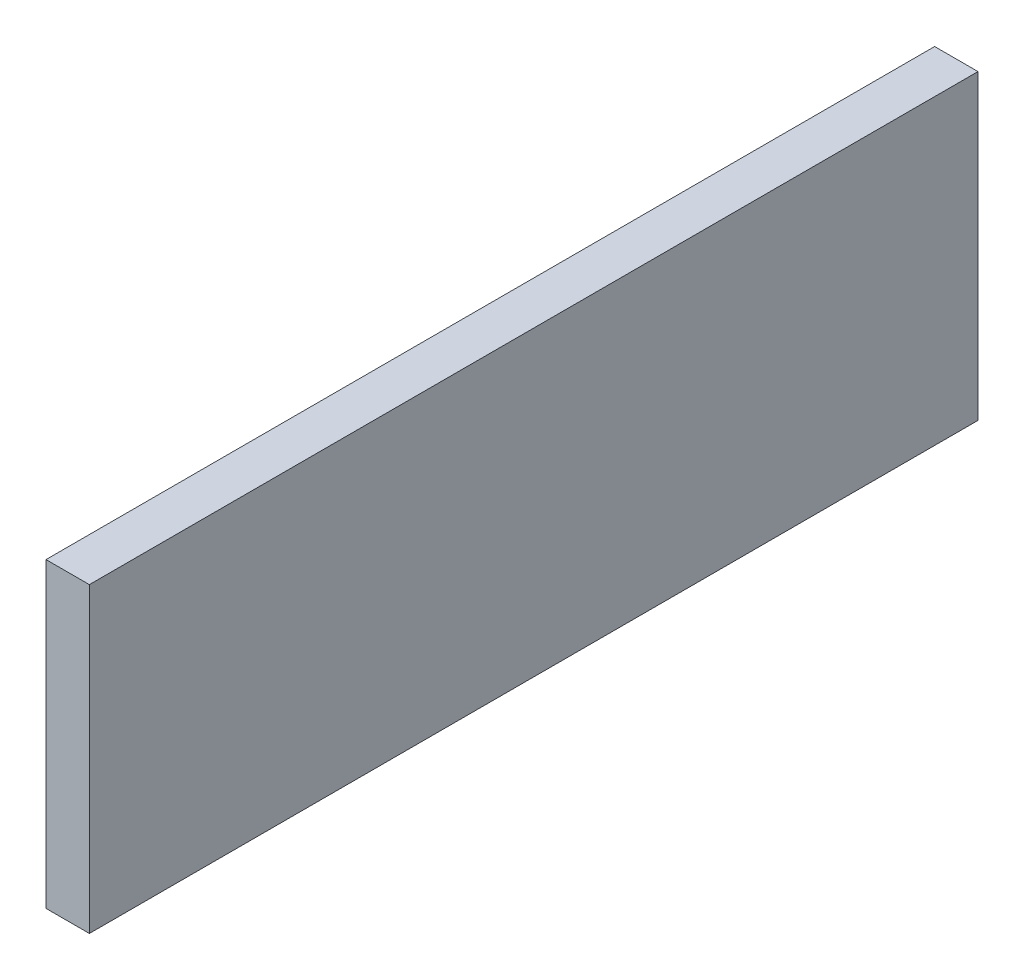
ISO-10303-21;
HEADER;
FILE_DESCRIPTION(('STEP AP214'),'2;1');
FILE_NAME('part.step','',(''),(''),'','','');
FILE_SCHEMA(('AUTOMOTIVE_DESIGN { 1 0 10303 214 1 1 1 1 }'));
ENDSEC;
DATA;
#1=APPLICATION_CONTEXT('core data for automotive mechanical design processes');
#2=APPLICATION_PROTOCOL_DEFINITION('international standard','automotive_design',2000,#1);
#3=PRODUCT_CONTEXT('',#1,'mechanical');
#4=PRODUCT('Part','Part','',(#3));
#5=PRODUCT_RELATED_PRODUCT_CATEGORY('part','',(#4));
#6=PRODUCT_DEFINITION_FORMATION('','',#4);
#7=PRODUCT_DEFINITION_CONTEXT('part definition',#1,'design');
#8=PRODUCT_DEFINITION('design','',#6,#7);
#9=PRODUCT_DEFINITION_SHAPE('','',#8);
#10=(LENGTH_UNIT() NAMED_UNIT(*) SI_UNIT(.MILLI.,.METRE.));
#11=(NAMED_UNIT(*) PLANE_ANGLE_UNIT() SI_UNIT($,.RADIAN.));
#12=(NAMED_UNIT(*) SI_UNIT($,.STERADIAN.) SOLID_ANGLE_UNIT());
#13=UNCERTAINTY_MEASURE_WITH_UNIT(LENGTH_MEASURE(1.E-05),#10,'distance_accuracy_value','');
#14=(GEOMETRIC_REPRESENTATION_CONTEXT(3) GLOBAL_UNCERTAINTY_ASSIGNED_CONTEXT((#13)) GLOBAL_UNIT_ASSIGNED_CONTEXT((#10,
#11,#12)) REPRESENTATION_CONTEXT('',''));
#15=CARTESIAN_POINT('',(0.,0.,0.));
#16=DIRECTION('',(0.,0.,1.));
#17=DIRECTION('',(1.,0.,0.));
#18=AXIS2_PLACEMENT_3D('',#15,#16,#17);
#19=CARTESIAN_POINT('',(12.2,42.5,-125.));
#20=DIRECTION('',(0.,0.,1.));
#21=DIRECTION('',(1.,0.,0.));
#22=AXIS2_PLACEMENT_3D('',#19,#20,#21);
#23=PLANE('',#22);
#24=DIRECTION('',(0.,1.,0.));
#25=VECTOR('',#24,1.);
#26=CARTESIAN_POINT('',(0.,42.5,-125.));
#27=LINE('',#26,#25);
#28=CARTESIAN_POINT('',(0.,-42.5,-125.));
#29=VERTEX_POINT('',#28);
#30=CARTESIAN_POINT('',(0.,42.5,-125.));
#31=VERTEX_POINT('',#30);
#32=EDGE_CURVE('E109',#29,#31,#27,.T.);
#33=ORIENTED_EDGE('',*,*,#32,.T.);
#34=DIRECTION('',(-1.,0.,0.));
#35=VECTOR('',#34,1.);
#36=CARTESIAN_POINT('',(12.2,42.5,-125.));
#37=LINE('',#36,#35);
#38=CARTESIAN_POINT('',(12.2,42.5,-125.));
#39=VERTEX_POINT('',#38);
#40=EDGE_CURVE('E11',#39,#31,#37,.T.);
#41=ORIENTED_EDGE('',*,*,#40,.F.);
#42=DIRECTION('',(0.,1.,0.));
#43=VECTOR('',#42,1.);
#44=CARTESIAN_POINT('',(12.2,42.5,-125.));
#45=LINE('',#44,#43);
#46=CARTESIAN_POINT('',(12.2,-42.5,-125.));
#47=VERTEX_POINT('',#46);
#48=EDGE_CURVE('E93',#47,#39,#45,.T.);
#49=ORIENTED_EDGE('',*,*,#48,.F.);
#50=DIRECTION('',(-1.,0.,0.));
#51=VECTOR('',#50,1.);
#52=CARTESIAN_POINT('',(12.2,-42.5,-125.));
#53=LINE('',#52,#51);
#54=EDGE_CURVE('E105',#47,#29,#53,.T.);
#55=ORIENTED_EDGE('',*,*,#54,.T.);
#56=EDGE_LOOP('',(#33,#41,#49,#55));
#57=FACE_BOUND('',#56,.T.);
#58=ADVANCED_FACE('F41',(#57),#23,.F.);
#59=CARTESIAN_POINT('',(12.2,42.5,125.));
#60=DIRECTION('',(0.,-1.,0.));
#61=DIRECTION('',(0.,0.,-1.));
#62=AXIS2_PLACEMENT_3D('',#59,#60,#61);
#63=PLANE('',#62);
#64=DIRECTION('',(0.,0.,1.));
#65=VECTOR('',#64,1.);
#66=CARTESIAN_POINT('',(0.,42.5,125.));
#67=LINE('',#66,#65);
#68=CARTESIAN_POINT('',(0.,42.5,125.));
#69=VERTEX_POINT('',#68);
#70=EDGE_CURVE('E98',#31,#69,#67,.T.);
#71=ORIENTED_EDGE('',*,*,#70,.T.);
#72=DIRECTION('',(-1.,0.,0.));
#73=VECTOR('',#72,1.);
#74=CARTESIAN_POINT('',(12.2,42.5,125.));
#75=LINE('',#74,#73);
#76=CARTESIAN_POINT('',(12.2,42.5,125.));
#77=VERTEX_POINT('',#76);
#78=EDGE_CURVE('E50',#77,#69,#75,.T.);
#79=ORIENTED_EDGE('',*,*,#78,.F.);
#80=DIRECTION('',(0.,0.,1.));
#81=VECTOR('',#80,1.);
#82=CARTESIAN_POINT('',(12.2,42.5,125.));
#83=LINE('',#82,#81);
#84=EDGE_CURVE('E88',#39,#77,#83,.T.);
#85=ORIENTED_EDGE('',*,*,#84,.F.);
#86=ORIENTED_EDGE('',*,*,#40,.T.);
#87=EDGE_LOOP('',(#71,#79,#85,#86));
#88=FACE_BOUND('',#87,.T.);
#89=ADVANCED_FACE('F97',(#88),#63,.F.);
#90=CARTESIAN_POINT('',(12.2,42.5,125.));
#91=DIRECTION('',(0.,0.,-1.));
#92=DIRECTION('',(0.,1.,0.));
#93=AXIS2_PLACEMENT_3D('',#90,#91,#92);
#94=PLANE('',#93);
#95=DIRECTION('',(0.,-1.,0.));
#96=VECTOR('',#95,1.);
#97=CARTESIAN_POINT('',(0.,42.5,125.));
#98=LINE('',#97,#96);
#99=CARTESIAN_POINT('',(0.,-42.5,125.));
#100=VERTEX_POINT('',#99);
#101=EDGE_CURVE('E75',#69,#100,#98,.T.);
#102=ORIENTED_EDGE('',*,*,#101,.T.);
#103=DIRECTION('',(-1.,0.,0.));
#104=VECTOR('',#103,1.);
#105=CARTESIAN_POINT('',(12.2,-42.5,125.));
#106=LINE('',#105,#104);
#107=CARTESIAN_POINT('',(12.2,-42.5,125.));
#108=VERTEX_POINT('',#107);
#109=EDGE_CURVE('E100',#108,#100,#106,.T.);
#110=ORIENTED_EDGE('',*,*,#109,.F.);
#111=DIRECTION('',(0.,-1.,0.));
#112=VECTOR('',#111,1.);
#113=CARTESIAN_POINT('',(12.2,42.5,125.));
#114=LINE('',#113,#112);
#115=EDGE_CURVE('E91',#77,#108,#114,.T.);
#116=ORIENTED_EDGE('',*,*,#115,.F.);
#117=ORIENTED_EDGE('',*,*,#78,.T.);
#118=EDGE_LOOP('',(#102,#110,#116,#117));
#119=FACE_BOUND('',#118,.T.);
#120=ADVANCED_FACE('F101',(#119),#94,.F.);
#121=CARTESIAN_POINT('',(12.2,-42.5,125.));
#122=DIRECTION('',(0.,1.,0.));
#123=DIRECTION('',(0.,0.,1.));
#124=AXIS2_PLACEMENT_3D('',#121,#122,#123);
#125=PLANE('',#124);
#126=DIRECTION('',(0.,0.,-1.));
#127=VECTOR('',#126,1.);
#128=CARTESIAN_POINT('',(0.,-42.5,125.));
#129=LINE('',#128,#127);
#130=EDGE_CURVE('E81',#100,#29,#129,.T.);
#131=ORIENTED_EDGE('',*,*,#130,.T.);
#132=ORIENTED_EDGE('',*,*,#54,.F.);
#133=DIRECTION('',(0.,0.,-1.));
#134=VECTOR('',#133,1.);
#135=CARTESIAN_POINT('',(12.2,-42.5,125.));
#136=LINE('',#135,#134);
#137=EDGE_CURVE('E58',#108,#47,#136,.T.);
#138=ORIENTED_EDGE('',*,*,#137,.F.);
#139=ORIENTED_EDGE('',*,*,#109,.T.);
#140=EDGE_LOOP('',(#131,#132,#138,#139));
#141=FACE_BOUND('',#140,.T.);
#142=ADVANCED_FACE('F122',(#141),#125,.F.);
#143=CARTESIAN_POINT('',(12.2,0.,0.));
#144=DIRECTION('',(1.,0.,0.));
#145=DIRECTION('',(0.,0.,-1.));
#146=AXIS2_PLACEMENT_3D('',#143,#144,#145);
#147=PLANE('',#146);
#148=ORIENTED_EDGE('',*,*,#48,.T.);
#149=ORIENTED_EDGE('',*,*,#84,.T.);
#150=ORIENTED_EDGE('',*,*,#115,.T.);
#151=ORIENTED_EDGE('',*,*,#137,.T.);
#152=EDGE_LOOP('',(#148,#149,#150,#151));
#153=FACE_BOUND('',#152,.T.);
#154=ADVANCED_FACE('F89',(#153),#147,.T.);
#155=CARTESIAN_POINT('',(0.,0.,0.));
#156=DIRECTION('',(1.,0.,0.));
#157=DIRECTION('',(0.,0.,-1.));
#158=AXIS2_PLACEMENT_3D('',#155,#156,#157);
#159=PLANE('',#158);
#160=ORIENTED_EDGE('',*,*,#32,.F.);
#161=ORIENTED_EDGE('',*,*,#130,.F.);
#162=ORIENTED_EDGE('',*,*,#101,.F.);
#163=ORIENTED_EDGE('',*,*,#70,.F.);
#164=EDGE_LOOP('',(#160,#161,#162,#163));
#165=FACE_BOUND('',#164,.T.);
#166=ADVANCED_FACE('F125',(#165),#159,.F.);
#167=CLOSED_SHELL('',(#58,#89,#120,#142,#154,#166));
#168=MANIFOLD_SOLID_BREP('B2',#167);
#169=ADVANCED_BREP_SHAPE_REPRESENTATION('',(#18,#168),#14);
#170=SHAPE_DEFINITION_REPRESENTATION(#9,#169);
ENDSEC;
END-ISO-10303-21;
